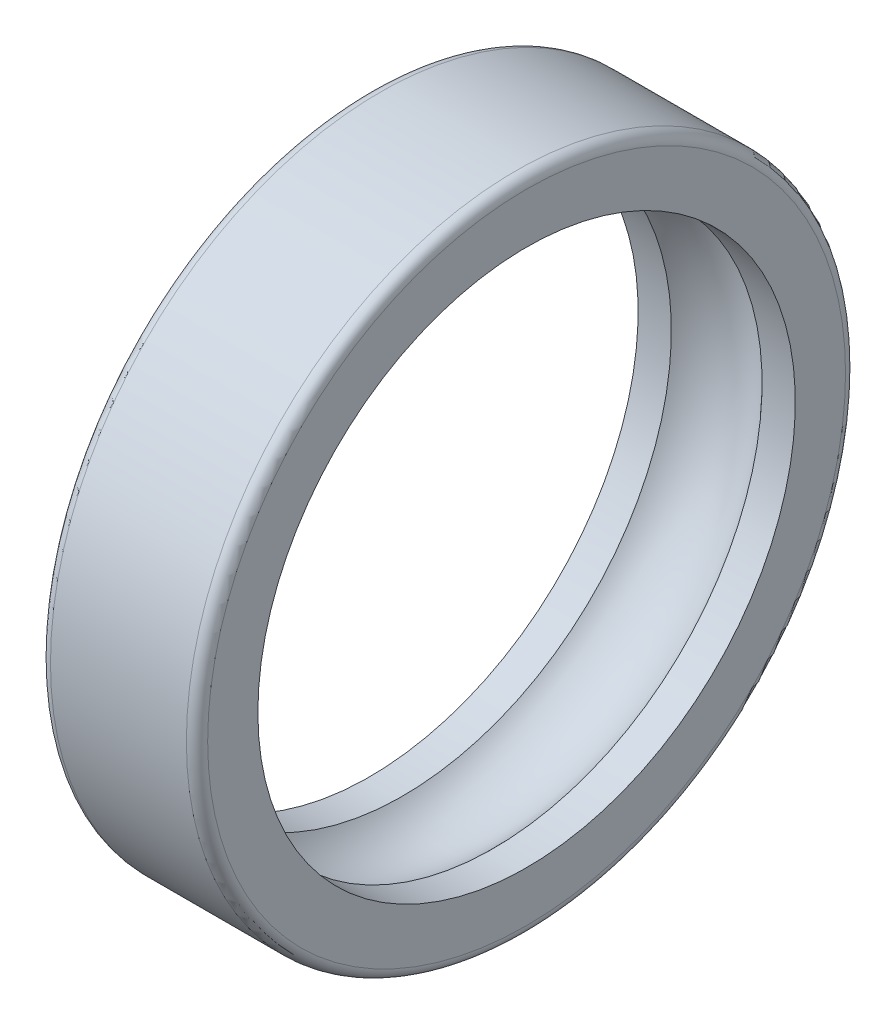
ISO-10303-21;
HEADER;
FILE_DESCRIPTION(('STEP AP214'),'2;1');
FILE_NAME('part.step','',(''),(''),'','','');
FILE_SCHEMA(('AUTOMOTIVE_DESIGN { 1 0 10303 214 1 1 1 1 }'));
ENDSEC;
DATA;
#1=APPLICATION_CONTEXT('core data for automotive mechanical design processes');
#2=APPLICATION_PROTOCOL_DEFINITION('international standard','automotive_design',2000,#1);
#3=PRODUCT_CONTEXT('',#1,'mechanical');
#4=PRODUCT('Part','Part','',(#3));
#5=PRODUCT_RELATED_PRODUCT_CATEGORY('part','',(#4));
#6=PRODUCT_DEFINITION_FORMATION('','',#4);
#7=PRODUCT_DEFINITION_CONTEXT('part definition',#1,'design');
#8=PRODUCT_DEFINITION('design','',#6,#7);
#9=PRODUCT_DEFINITION_SHAPE('','',#8);
#10=(LENGTH_UNIT() NAMED_UNIT(*) SI_UNIT(.MILLI.,.METRE.));
#11=(NAMED_UNIT(*) PLANE_ANGLE_UNIT() SI_UNIT($,.RADIAN.));
#12=(NAMED_UNIT(*) SI_UNIT($,.STERADIAN.) SOLID_ANGLE_UNIT());
#13=UNCERTAINTY_MEASURE_WITH_UNIT(LENGTH_MEASURE(1.E-05),#10,'distance_accuracy_value','');
#14=(GEOMETRIC_REPRESENTATION_CONTEXT(3) GLOBAL_UNCERTAINTY_ASSIGNED_CONTEXT((#13)) GLOBAL_UNIT_ASSIGNED_CONTEXT((#10,
#11,#12)) REPRESENTATION_CONTEXT('',''));
#15=CARTESIAN_POINT('',(0.,0.,0.));
#16=DIRECTION('',(0.,0.,1.));
#17=DIRECTION('',(1.,0.,0.));
#18=AXIS2_PLACEMENT_3D('',#15,#16,#17);
#19=CARTESIAN_POINT('',(-45.2666028097063,0.,0.));
#20=DIRECTION('',(-1.,0.,0.));
#21=DIRECTION('',(0.,0.,1.));
#22=AXIS2_PLACEMENT_3D('',#19,#20,#21);
#23=CYLINDRICAL_SURFACE('',#22,53.);
#24=CARTESIAN_POINT('',(15.5,0.,0.));
#25=DIRECTION('',(-1.,0.,0.));
#26=DIRECTION('',(0.,0.,1.));
#27=AXIS2_PLACEMENT_3D('',#24,#25,#26);
#28=CIRCLE('',#27,53.);
#29=CARTESIAN_POINT('',(15.5,0.,53.));
#30=VERTEX_POINT('',#29);
#31=EDGE_CURVE('E57',#30,#30,#28,.T.);
#32=ORIENTED_EDGE('',*,*,#31,.F.);
#33=EDGE_LOOP('',(#32));
#34=FACE_BOUND('',#33,.T.);
#35=CARTESIAN_POINT('',(8.94427190999917,0.,0.));
#36=DIRECTION('',(-1.,0.,0.));
#37=DIRECTION('',(0.,0.,1.));
#38=AXIS2_PLACEMENT_3D('',#35,#36,#37);
#39=CIRCLE('',#38,53.);
#40=CARTESIAN_POINT('',(8.94427190999917,0.,53.));
#41=VERTEX_POINT('',#40);
#42=EDGE_CURVE('E66',#41,#41,#39,.T.);
#43=ORIENTED_EDGE('',*,*,#42,.T.);
#44=EDGE_LOOP('',(#43));
#45=FACE_BOUND('',#44,.T.);
#46=ADVANCED_FACE('F37',(#34,#45),#23,.F.);
#47=CARTESIAN_POINT('',(15.5,65.,0.));
#48=DIRECTION('',(-1.,0.,0.));
#49=DIRECTION('',(0.,0.,1.));
#50=AXIS2_PLACEMENT_3D('',#47,#48,#49);
#51=PLANE('',#50);
#52=CARTESIAN_POINT('',(15.5,0.,0.));
#53=DIRECTION('',(-1.,0.,0.));
#54=DIRECTION('',(0.,0.,1.));
#55=AXIS2_PLACEMENT_3D('',#52,#53,#54);
#56=CIRCLE('',#55,62.9);
#57=CARTESIAN_POINT('',(15.5,0.,62.9));
#58=VERTEX_POINT('',#57);
#59=EDGE_CURVE('E44',#58,#58,#56,.F.);
#60=ORIENTED_EDGE('',*,*,#59,.T.);
#61=EDGE_LOOP('',(#60));
#62=FACE_BOUND('',#61,.T.);
#63=ORIENTED_EDGE('',*,*,#31,.T.);
#64=EDGE_LOOP('',(#63));
#65=FACE_BOUND('',#64,.T.);
#66=ADVANCED_FACE('F91',(#62,#65),#51,.F.);
#67=CARTESIAN_POINT('',(-45.2666028097063,0.,0.));
#68=DIRECTION('',(-1.,0.,0.));
#69=DIRECTION('',(0.,0.,1.));
#70=AXIS2_PLACEMENT_3D('',#67,#68,#69);
#71=CYLINDRICAL_SURFACE('',#70,65.);
#72=CARTESIAN_POINT('',(13.4,0.,0.));
#73=DIRECTION('',(-1.,0.,0.));
#74=DIRECTION('',(0.,0.,1.));
#75=AXIS2_PLACEMENT_3D('',#72,#73,#74);
#76=CIRCLE('',#75,65.);
#77=CARTESIAN_POINT('',(13.4,0.,65.));
#78=VERTEX_POINT('',#77);
#79=EDGE_CURVE('E48',#78,#78,#76,.T.);
#80=ORIENTED_EDGE('',*,*,#79,.T.);
#81=EDGE_LOOP('',(#80));
#82=FACE_BOUND('',#81,.T.);
#83=CARTESIAN_POINT('',(-13.4,0.,0.));
#84=DIRECTION('',(1.,0.,0.));
#85=DIRECTION('',(0.,0.,-1.));
#86=AXIS2_PLACEMENT_3D('',#83,#84,#85);
#87=CIRCLE('',#86,65.);
#88=CARTESIAN_POINT('',(-13.4,0.,-65.));
#89=VERTEX_POINT('',#88);
#90=EDGE_CURVE('E52',#89,#89,#87,.T.);
#91=ORIENTED_EDGE('',*,*,#90,.T.);
#92=EDGE_LOOP('',(#91));
#93=FACE_BOUND('',#92,.T.);
#94=ADVANCED_FACE('F86',(#82,#93),#71,.T.);
#95=CARTESIAN_POINT('',(-15.5,65.,0.));
#96=DIRECTION('',(1.,0.,0.));
#97=DIRECTION('',(0.,0.,-1.));
#98=AXIS2_PLACEMENT_3D('',#95,#96,#97);
#99=PLANE('',#98);
#100=CARTESIAN_POINT('',(-15.5,0.,0.));
#101=DIRECTION('',(1.,0.,0.));
#102=DIRECTION('',(0.,0.,-1.));
#103=AXIS2_PLACEMENT_3D('',#100,#101,#102);
#104=CIRCLE('',#103,62.9);
#105=CARTESIAN_POINT('',(-15.5,0.,-62.9));
#106=VERTEX_POINT('',#105);
#107=EDGE_CURVE('E10',#106,#106,#104,.F.);
#108=ORIENTED_EDGE('',*,*,#107,.T.);
#109=EDGE_LOOP('',(#108));
#110=FACE_BOUND('',#109,.T.);
#111=CARTESIAN_POINT('',(-15.5,0.,0.));
#112=DIRECTION('',(-1.,0.,0.));
#113=DIRECTION('',(0.,0.,1.));
#114=AXIS2_PLACEMENT_3D('',#111,#112,#113);
#115=CIRCLE('',#114,53.);
#116=CARTESIAN_POINT('',(-15.5,0.,53.));
#117=VERTEX_POINT('',#116);
#118=EDGE_CURVE('E60',#117,#117,#115,.T.);
#119=ORIENTED_EDGE('',*,*,#118,.F.);
#120=EDGE_LOOP('',(#119));
#121=FACE_BOUND('',#120,.T.);
#122=ADVANCED_FACE('F81',(#110,#121),#99,.F.);
#123=CARTESIAN_POINT('',(-45.2666028097063,0.,0.));
#124=DIRECTION('',(-1.,0.,0.));
#125=DIRECTION('',(0.,0.,1.));
#126=AXIS2_PLACEMENT_3D('',#123,#124,#125);
#127=CYLINDRICAL_SURFACE('',#126,53.);
#128=CARTESIAN_POINT('',(-8.94427190999916,0.,0.));
#129=DIRECTION('',(-1.,0.,0.));
#130=DIRECTION('',(0.,0.,1.));
#131=AXIS2_PLACEMENT_3D('',#128,#129,#130);
#132=CIRCLE('',#131,53.);
#133=CARTESIAN_POINT('',(-8.94427190999916,0.,53.));
#134=VERTEX_POINT('',#133);
#135=EDGE_CURVE('E63',#134,#134,#132,.T.);
#136=ORIENTED_EDGE('',*,*,#135,.F.);
#137=EDGE_LOOP('',(#136));
#138=FACE_BOUND('',#137,.T.);
#139=ORIENTED_EDGE('',*,*,#118,.T.);
#140=EDGE_LOOP('',(#139));
#141=FACE_BOUND('',#140,.T.);
#142=ADVANCED_FACE('F75',(#138,#141),#127,.F.);
#143=CARTESIAN_POINT('',(0.,0.,0.));
#144=DIRECTION('',(-1.,0.,0.));
#145=DIRECTION('',(0.,0.,1.));
#146=AXIS2_PLACEMENT_3D('',#143,#144,#145);
#147=TOROIDAL_SURFACE('',#146,45.,12.);
#148=ORIENTED_EDGE('',*,*,#42,.F.);
#149=EDGE_LOOP('',(#148));
#150=FACE_BOUND('',#149,.T.);
#151=ORIENTED_EDGE('',*,*,#135,.T.);
#152=EDGE_LOOP('',(#151));
#153=FACE_BOUND('',#152,.T.);
#154=ADVANCED_FACE('F71',(#150,#153),#147,.F.);
#155=CARTESIAN_POINT('',(13.4,0.,0.));
#156=DIRECTION('',(-1.,0.,0.));
#157=DIRECTION('',(0.,0.,1.));
#158=AXIS2_PLACEMENT_3D('',#155,#156,#157);
#159=TOROIDAL_SURFACE('',#158,62.9,2.1);
#160=ORIENTED_EDGE('',*,*,#59,.F.);
#161=EDGE_LOOP('',(#160));
#162=FACE_BOUND('',#161,.T.);
#163=ORIENTED_EDGE('',*,*,#79,.F.);
#164=EDGE_LOOP('',(#163));
#165=FACE_BOUND('',#164,.T.);
#166=ADVANCED_FACE('F74',(#162,#165),#159,.T.);
#167=CARTESIAN_POINT('',(-13.4,0.,0.));
#168=DIRECTION('',(1.,0.,0.));
#169=DIRECTION('',(0.,0.,-1.));
#170=AXIS2_PLACEMENT_3D('',#167,#168,#169);
#171=TOROIDAL_SURFACE('',#170,62.9,2.1);
#172=ORIENTED_EDGE('',*,*,#90,.F.);
#173=EDGE_LOOP('',(#172));
#174=FACE_BOUND('',#173,.T.);
#175=ORIENTED_EDGE('',*,*,#107,.F.);
#176=EDGE_LOOP('',(#175));
#177=FACE_BOUND('',#176,.T.);
#178=ADVANCED_FACE('F39',(#174,#177),#171,.T.);
#179=CLOSED_SHELL('',(#46,#66,#94,#122,#142,#154,#166,#178));
#180=MANIFOLD_SOLID_BREP('B2',#179);
#181=ADVANCED_BREP_SHAPE_REPRESENTATION('',(#18,#180),#14);
#182=SHAPE_DEFINITION_REPRESENTATION(#9,#181);
ENDSEC;
END-ISO-10303-21;
